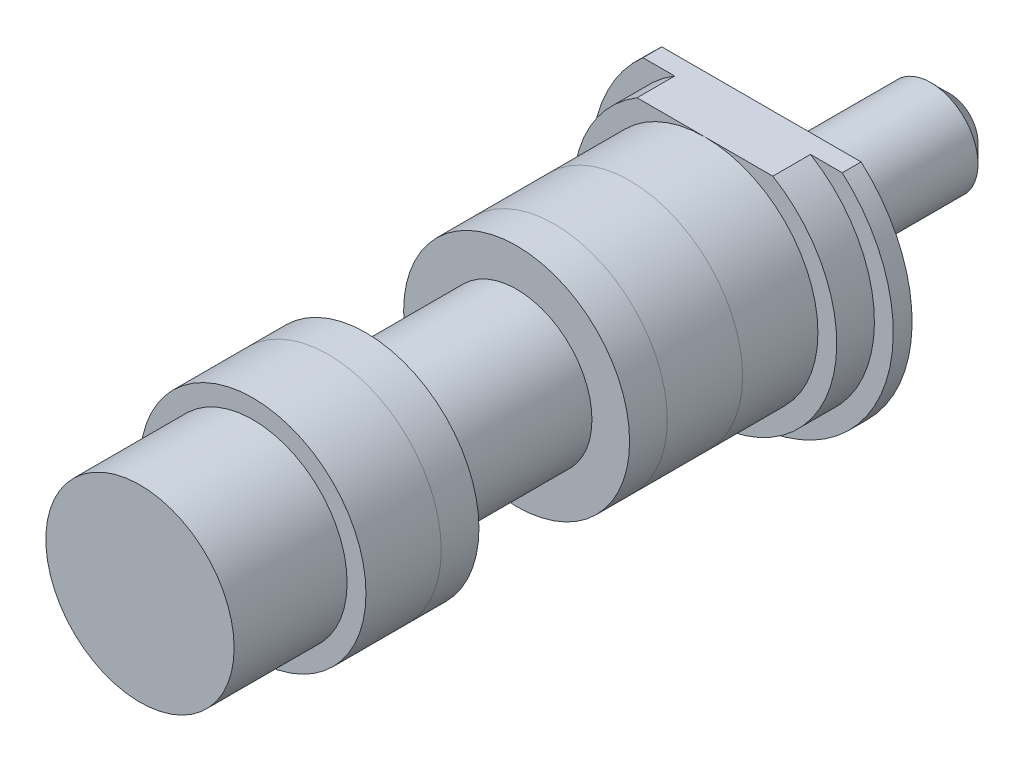
ISO-10303-21;
HEADER;
FILE_DESCRIPTION(('STEP AP214'),'2;1');
FILE_NAME('part.step','',(''),(''),'','','');
FILE_SCHEMA(('AUTOMOTIVE_DESIGN { 1 0 10303 214 1 1 1 1 }'));
ENDSEC;
DATA;
#1=APPLICATION_CONTEXT('core data for automotive mechanical design processes');
#2=APPLICATION_PROTOCOL_DEFINITION('international standard','automotive_design',2000,#1);
#3=PRODUCT_CONTEXT('',#1,'mechanical');
#4=PRODUCT('Part','Part','',(#3));
#5=PRODUCT_RELATED_PRODUCT_CATEGORY('part','',(#4));
#6=PRODUCT_DEFINITION_FORMATION('','',#4);
#7=PRODUCT_DEFINITION_CONTEXT('part definition',#1,'design');
#8=PRODUCT_DEFINITION('design','',#6,#7);
#9=PRODUCT_DEFINITION_SHAPE('','',#8);
#10=(LENGTH_UNIT() NAMED_UNIT(*) SI_UNIT(.MILLI.,.METRE.));
#11=(NAMED_UNIT(*) PLANE_ANGLE_UNIT() SI_UNIT($,.RADIAN.));
#12=(NAMED_UNIT(*) SI_UNIT($,.STERADIAN.) SOLID_ANGLE_UNIT());
#13=UNCERTAINTY_MEASURE_WITH_UNIT(LENGTH_MEASURE(1.E-05),#10,'distance_accuracy_value','');
#14=(GEOMETRIC_REPRESENTATION_CONTEXT(3) GLOBAL_UNCERTAINTY_ASSIGNED_CONTEXT((#13)) GLOBAL_UNIT_ASSIGNED_CONTEXT((#10,
#11,#12)) REPRESENTATION_CONTEXT('',''));
#15=CARTESIAN_POINT('',(0.,0.,0.));
#16=DIRECTION('',(0.,0.,1.));
#17=DIRECTION('',(1.,0.,0.));
#18=AXIS2_PLACEMENT_3D('',#15,#16,#17);
#19=CARTESIAN_POINT('',(0.,1.99999999999998,11.5));
#20=DIRECTION('',(0.,0.,-1.));
#21=DIRECTION('',(-1.,0.,0.));
#22=AXIS2_PLACEMENT_3D('',#19,#20,#21);
#23=PLANE('',#22);
#24=CARTESIAN_POINT('',(0.,0.,11.5));
#25=DIRECTION('',(0.,0.,-1.));
#26=DIRECTION('',(-1.,0.,0.));
#27=AXIS2_PLACEMENT_3D('',#24,#25,#26);
#28=CIRCLE('',#27,3.);
#29=CARTESIAN_POINT('',(-3.,0.,11.5));
#30=VERTEX_POINT('',#29);
#31=EDGE_CURVE('E11',#30,#30,#28,.T.);
#32=ORIENTED_EDGE('',*,*,#31,.T.);
#33=EDGE_LOOP('',(#32));
#34=FACE_BOUND('',#33,.T.);
#35=CARTESIAN_POINT('',(0.,0.,11.5));
#36=DIRECTION('',(0.,0.,-1.));
#37=DIRECTION('',(-1.,0.,0.));
#38=AXIS2_PLACEMENT_3D('',#35,#36,#37);
#39=CIRCLE('',#38,2.);
#40=CARTESIAN_POINT('',(-2.,0.,11.5));
#41=VERTEX_POINT('',#40);
#42=EDGE_CURVE('E57',#41,#41,#39,.T.);
#43=ORIENTED_EDGE('',*,*,#42,.F.);
#44=EDGE_LOOP('',(#43));
#45=FACE_BOUND('',#44,.T.);
#46=ADVANCED_FACE('F43',(#34,#45),#23,.T.);
#47=CARTESIAN_POINT('',(0.,0.,-0.79734990336431));
#48=DIRECTION('',(0.,0.,-1.));
#49=DIRECTION('',(-1.,0.,0.));
#50=AXIS2_PLACEMENT_3D('',#47,#48,#49);
#51=CYLINDRICAL_SURFACE('',#50,3.);
#52=CARTESIAN_POINT('',(0.,0.,13.5));
#53=DIRECTION('',(0.,0.,-1.));
#54=DIRECTION('',(-1.,0.,0.));
#55=AXIS2_PLACEMENT_3D('',#52,#53,#54);
#56=CIRCLE('',#55,3.);
#57=CARTESIAN_POINT('',(-3.,0.,13.5));
#58=VERTEX_POINT('',#57);
#59=EDGE_CURVE('E49',#58,#58,#56,.T.);
#60=ORIENTED_EDGE('',*,*,#59,.T.);
#61=EDGE_LOOP('',(#60));
#62=FACE_BOUND('',#61,.T.);
#63=ORIENTED_EDGE('',*,*,#31,.F.);
#64=EDGE_LOOP('',(#63));
#65=FACE_BOUND('',#64,.T.);
#66=ADVANCED_FACE('F67',(#62,#65),#51,.T.);
#67=CARTESIAN_POINT('',(0.,2.,13.5));
#68=DIRECTION('',(0.,0.,1.));
#69=DIRECTION('',(1.,0.,0.));
#70=AXIS2_PLACEMENT_3D('',#67,#68,#69);
#71=PLANE('',#70);
#72=CARTESIAN_POINT('',(0.,0.,13.5));
#73=DIRECTION('',(0.,0.,-1.));
#74=DIRECTION('',(-1.,0.,0.));
#75=AXIS2_PLACEMENT_3D('',#72,#73,#74);
#76=CIRCLE('',#75,2.);
#77=CARTESIAN_POINT('',(-2.,0.,13.5));
#78=VERTEX_POINT('',#77);
#79=EDGE_CURVE('E53',#78,#78,#76,.T.);
#80=ORIENTED_EDGE('',*,*,#79,.T.);
#81=EDGE_LOOP('',(#80));
#82=FACE_BOUND('',#81,.T.);
#83=ORIENTED_EDGE('',*,*,#59,.F.);
#84=EDGE_LOOP('',(#83));
#85=FACE_BOUND('',#84,.T.);
#86=ADVANCED_FACE('F71',(#82,#85),#71,.T.);
#87=CARTESIAN_POINT('',(0.,0.,-0.79734990336431));
#88=DIRECTION('',(0.,0.,-1.));
#89=DIRECTION('',(-1.,0.,0.));
#90=AXIS2_PLACEMENT_3D('',#87,#88,#89);
#91=CYLINDRICAL_SURFACE('',#90,2.);
#92=ORIENTED_EDGE('',*,*,#42,.T.);
#93=EDGE_LOOP('',(#92));
#94=FACE_BOUND('',#93,.T.);
#95=ORIENTED_EDGE('',*,*,#79,.F.);
#96=EDGE_LOOP('',(#95));
#97=FACE_BOUND('',#96,.T.);
#98=ADVANCED_FACE('F63',(#94,#97),#91,.F.);
#99=CLOSED_SHELL('',(#46,#66,#86,#98));
#100=MANIFOLD_SOLID_BREP('B2',#99);
#101=CARTESIAN_POINT('',(0.,1.99999999999997,3.49999999999999));
#102=DIRECTION('',(0.,0.,-1.));
#103=DIRECTION('',(-1.,0.,0.));
#104=AXIS2_PLACEMENT_3D('',#101,#102,#103);
#105=PLANE('',#104);
#106=CARTESIAN_POINT('',(0.,0.,3.5));
#107=DIRECTION('',(0.,0.,-1.));
#108=DIRECTION('',(-1.,0.,0.));
#109=AXIS2_PLACEMENT_3D('',#106,#107,#108);
#110=CIRCLE('',#109,3.);
#111=CARTESIAN_POINT('',(-3.,0.,3.5));
#112=VERTEX_POINT('',#111);
#113=EDGE_CURVE('E42',#112,#112,#110,.T.);
#114=ORIENTED_EDGE('',*,*,#113,.T.);
#115=EDGE_LOOP('',(#114));
#116=FACE_BOUND('',#115,.T.);
#117=CARTESIAN_POINT('',(0.,0.,3.5));
#118=DIRECTION('',(0.,0.,-1.));
#119=DIRECTION('',(-1.,0.,0.));
#120=AXIS2_PLACEMENT_3D('',#117,#118,#119);
#121=CIRCLE('',#120,2.);
#122=CARTESIAN_POINT('',(-2.,0.,3.5));
#123=VERTEX_POINT('',#122);
#124=EDGE_CURVE('E127',#123,#123,#121,.T.);
#125=ORIENTED_EDGE('',*,*,#124,.F.);
#126=EDGE_LOOP('',(#125));
#127=FACE_BOUND('',#126,.T.);
#128=ADVANCED_FACE('F113',(#116,#127),#105,.T.);
#129=CARTESIAN_POINT('',(0.,0.,-2.31170156855508));
#130=DIRECTION('',(0.,0.,-1.));
#131=DIRECTION('',(-1.,0.,0.));
#132=AXIS2_PLACEMENT_3D('',#129,#130,#131);
#133=CYLINDRICAL_SURFACE('',#132,3.);
#134=CARTESIAN_POINT('',(0.,0.,5.49999999999998));
#135=DIRECTION('',(0.,0.,-1.));
#136=DIRECTION('',(-1.,0.,0.));
#137=AXIS2_PLACEMENT_3D('',#134,#135,#136);
#138=CIRCLE('',#137,3.);
#139=CARTESIAN_POINT('',(-3.,0.,5.49999999999998));
#140=VERTEX_POINT('',#139);
#141=EDGE_CURVE('E119',#140,#140,#138,.T.);
#142=ORIENTED_EDGE('',*,*,#141,.T.);
#143=EDGE_LOOP('',(#142));
#144=FACE_BOUND('',#143,.T.);
#145=ORIENTED_EDGE('',*,*,#113,.F.);
#146=EDGE_LOOP('',(#145));
#147=FACE_BOUND('',#146,.T.);
#148=ADVANCED_FACE('F137',(#144,#147),#133,.T.);
#149=CARTESIAN_POINT('',(0.,1.99999999999996,5.49999999999999));
#150=DIRECTION('',(0.,0.,1.));
#151=DIRECTION('',(1.,0.,0.));
#152=AXIS2_PLACEMENT_3D('',#149,#150,#151);
#153=PLANE('',#152);
#154=CARTESIAN_POINT('',(0.,0.,5.49999999999998));
#155=DIRECTION('',(0.,0.,-1.));
#156=DIRECTION('',(-1.,0.,0.));
#157=AXIS2_PLACEMENT_3D('',#154,#155,#156);
#158=CIRCLE('',#157,2.);
#159=CARTESIAN_POINT('',(-2.,0.,5.49999999999998));
#160=VERTEX_POINT('',#159);
#161=EDGE_CURVE('E123',#160,#160,#158,.T.);
#162=ORIENTED_EDGE('',*,*,#161,.T.);
#163=EDGE_LOOP('',(#162));
#164=FACE_BOUND('',#163,.T.);
#165=ORIENTED_EDGE('',*,*,#141,.F.);
#166=EDGE_LOOP('',(#165));
#167=FACE_BOUND('',#166,.T.);
#168=ADVANCED_FACE('F141',(#164,#167),#153,.T.);
#169=CARTESIAN_POINT('',(0.,0.,-2.31170156855508));
#170=DIRECTION('',(0.,0.,-1.));
#171=DIRECTION('',(-1.,0.,0.));
#172=AXIS2_PLACEMENT_3D('',#169,#170,#171);
#173=CYLINDRICAL_SURFACE('',#172,2.);
#174=ORIENTED_EDGE('',*,*,#124,.T.);
#175=EDGE_LOOP('',(#174));
#176=FACE_BOUND('',#175,.T.);
#177=ORIENTED_EDGE('',*,*,#161,.F.);
#178=EDGE_LOOP('',(#177));
#179=FACE_BOUND('',#178,.T.);
#180=ADVANCED_FACE('F133',(#176,#179),#173,.F.);
#181=CLOSED_SHELL('',(#128,#148,#168,#180));
#182=MANIFOLD_SOLID_BREP('B6',#181);
#183=CARTESIAN_POINT('',(0.,0.,10.5));
#184=DIRECTION('',(0.,0.,-1.));
#185=DIRECTION('',(-1.,0.,0.));
#186=AXIS2_PLACEMENT_3D('',#183,#184,#185);
#187=CYLINDRICAL_SURFACE('',#186,2.);
#188=CARTESIAN_POINT('',(0.,0.,10.5));
#189=DIRECTION('',(0.,0.,1.));
#190=DIRECTION('',(1.,0.,0.));
#191=AXIS2_PLACEMENT_3D('',#188,#189,#190);
#192=CIRCLE('',#191,2.);
#193=CARTESIAN_POINT('',(2.,0.,10.5));
#194=VERTEX_POINT('',#193);
#195=EDGE_CURVE('E275',#194,#194,#192,.T.);
#196=ORIENTED_EDGE('',*,*,#195,.F.);
#197=EDGE_LOOP('',(#196));
#198=FACE_BOUND('',#197,.T.);
#199=CARTESIAN_POINT('',(0.,0.,6.49999999999998));
#200=DIRECTION('',(0.,0.,1.));
#201=DIRECTION('',(1.,0.,0.));
#202=AXIS2_PLACEMENT_3D('',#199,#200,#201);
#203=CIRCLE('',#202,2.);
#204=CARTESIAN_POINT('',(2.,0.,6.49999999999998));
#205=VERTEX_POINT('',#204);
#206=EDGE_CURVE('E271',#205,#205,#203,.T.);
#207=ORIENTED_EDGE('',*,*,#206,.T.);
#208=EDGE_LOOP('',(#207));
#209=FACE_BOUND('',#208,.T.);
#210=CARTESIAN_POINT('',(-2.,0.,8.99999999999998));
#211=CARTESIAN_POINT('',(-1.99999953289337,0.0276253628898729,8.99999922475393));
#212=CARTESIAN_POINT('',(-1.99942192710609,0.0552593859435506,8.99770281640871));
#213=CARTESIAN_POINT('',(-1.9971737127663,0.109735441256813,8.98859161623099));
#214=CARTESIAN_POINT('',(-1.99550248473322,0.136577015623555,8.98177426348739));
#215=CARTESIAN_POINT('',(-1.99125208777346,0.188673624060829,8.96385358217932));
#216=CARTESIAN_POINT('',(-1.98867400947362,0.213930521143294,8.95275540042823));
#217=CARTESIAN_POINT('',(-1.98288447935864,0.262224043968098,8.92660620331838));
#218=CARTESIAN_POINT('',(-1.97967300618017,0.285260594782882,8.91155505462702));
#219=CARTESIAN_POINT('',(-1.97289137863934,0.328933975766938,8.87759973678193));
#220=CARTESIAN_POINT('',(-1.96931569049511,0.34951856335365,8.85862947501359));
#221=CARTESIAN_POINT('',(-1.96224540039176,0.387249642401079,8.81751593169701));
#222=CARTESIAN_POINT('',(-1.95875080762783,0.404395745649712,8.79537229235116));
#223=CARTESIAN_POINT('',(-1.9521825856657,0.435008847599675,8.74813492442085));
#224=CARTESIAN_POINT('',(-1.94911598156868,0.448417405308423,8.72300225639652));
#225=CARTESIAN_POINT('',(-1.94383164937407,0.470798969516814,8.6707505294472));
#226=CARTESIAN_POINT('',(-1.94161378557597,0.479772685146441,8.6436317888914));
#227=CARTESIAN_POINT('',(-1.93833492239184,0.492851612268097,8.58875216726584));
#228=CARTESIAN_POINT('',(-1.93725163691808,0.497050756111091,8.56101503465006));
#229=CARTESIAN_POINT('',(-1.9362978751258,0.500753925022583,8.50521047699534));
#230=CARTESIAN_POINT('',(-1.93642720149548,0.500258713939301,8.47714310643379));
#231=CARTESIAN_POINT('',(-1.93786401832206,0.494662174879744,8.42219473075184));
#232=CARTESIAN_POINT('',(-1.93914287667292,0.489672780063489,8.39530145951163));
#233=CARTESIAN_POINT('',(-1.94268903225494,0.475408062301011,8.3427463163629));
#234=CARTESIAN_POINT('',(-1.94495639990232,0.466132434023111,8.31708453232368));
#235=CARTESIAN_POINT('',(-1.95025037968062,0.44346315931236,8.26742066124931));
#236=CARTESIAN_POINT('',(-1.95328442489807,0.430028889077622,8.24343794273681));
#237=CARTESIAN_POINT('',(-1.95976570282128,0.399452092004969,8.19802709674772));
#238=CARTESIAN_POINT('',(-1.96321300778245,0.382308916269587,8.17659941731092));
#239=CARTESIAN_POINT('',(-1.9702529351326,0.344221141560379,8.1362654614352));
#240=CARTESIAN_POINT('',(-1.9738468982599,0.323182086055272,8.11744850331288));
#241=CARTESIAN_POINT('',(-1.98068655192928,0.278203972501227,8.08359291917869));
#242=CARTESIAN_POINT('',(-1.98393223183138,0.254264825902638,8.06855440857881));
#243=CARTESIAN_POINT('',(-1.98972577364727,0.204038629560454,8.04264980459187));
#244=CARTESIAN_POINT('',(-1.99227120042574,0.1777437977362,8.03179821991518));
#245=CARTESIAN_POINT('',(-1.99635972330472,0.12362533604762,8.01469423143013));
#246=CARTESIAN_POINT('',(-1.99790301113094,0.0958019997168172,8.00844094786062));
#247=CARTESIAN_POINT('',(-1.99978499757125,0.0401799901299966,8.00084747814705));
#248=CARTESIAN_POINT('',(-2.00015351169426,0.0123989066627261,7.99938565797488));
#249=CARTESIAN_POINT('',(-1.9997293493815,-0.0430109582671733,8.00108300068514));
#250=CARTESIAN_POINT('',(-1.99893677747282,-0.0706397532148641,8.00424174759971));
#251=CARTESIAN_POINT('',(-1.99629860375786,-0.124538089592167,8.01499030279712));
#252=CARTESIAN_POINT('',(-1.99446878061937,-0.150821706322929,8.0225137544923));
#253=CARTESIAN_POINT('',(-1.98996235544711,-0.201752430817512,8.04170236134279));
#254=CARTESIAN_POINT('',(-1.98728566789964,-0.226399373010876,8.05336793477105));
#255=CARTESIAN_POINT('',(-1.98131102642103,-0.273841044809955,8.08074537629157));
#256=CARTESIAN_POINT('',(-1.9780028912231,-0.296595147278635,8.0965253707989));
#257=CARTESIAN_POINT('',(-1.97114836395806,-0.339175537881106,8.13159663626563));
#258=CARTESIAN_POINT('',(-1.96760193083902,-0.359001319657674,8.15088851320564));
#259=CARTESIAN_POINT('',(-1.96056318986924,-0.395663522690919,8.19300065361483));
#260=CARTESIAN_POINT('',(-1.95707434729093,-0.412414622540711,8.21589590100079));
#261=CARTESIAN_POINT('',(-1.95064292792412,-0.441836919670929,8.26424421148856));
#262=CARTESIAN_POINT('',(-1.94770032689009,-0.454508298052647,8.28969716098658));
#263=CARTESIAN_POINT('',(-1.94272698244888,-0.475317140203098,8.34230190747103));
#264=CARTESIAN_POINT('',(-1.94069085097301,-0.483481465551383,8.36944254278133));
#265=CARTESIAN_POINT('',(-1.93775581363394,-0.495115219984628,8.42476987929636));
#266=CARTESIAN_POINT('',(-1.93685665906646,-0.498585675826234,8.45295635034416));
#267=CARTESIAN_POINT('',(-1.93631633734653,-0.500679530111343,8.50870700795174));
#268=CARTESIAN_POINT('',(-1.93663977576088,-0.499439299260066,8.53626581170825));
#269=CARTESIAN_POINT('',(-1.93842636335947,-0.49245909277098,8.59076796288933));
#270=CARTESIAN_POINT('',(-1.93988948963952,-0.486719207562264,8.61771132267122));
#271=CARTESIAN_POINT('',(-1.94377086894241,-0.470977106480931,8.67006948635514));
#272=CARTESIAN_POINT('',(-1.94618338412103,-0.461000468226801,8.69549243508007));
#273=CARTESIAN_POINT('',(-1.95169251908276,-0.43708830453505,8.7443217942379));
#274=CARTESIAN_POINT('',(-1.95478923373591,-0.42315223001143,8.76772792439564));
#275=CARTESIAN_POINT('',(-1.96141878087837,-0.391289249545744,8.81251820966733));
#276=CARTESIAN_POINT('',(-1.96496088277252,-0.373267720970773,8.8338336911413));
#277=CARTESIAN_POINT('',(-1.97202675748762,-0.333929790396603,8.87318234826512));
#278=CARTESIAN_POINT('',(-1.97555052575687,-0.312612607087086,8.89121474337099));
#279=CARTESIAN_POINT('',(-1.98225885215888,-0.266822528900902,8.92380376952153));
#280=CARTESIAN_POINT('',(-1.98543611121956,-0.242299474105488,8.93829153789051));
#281=CARTESIAN_POINT('',(-1.99101641658372,-0.19108868650351,8.96291582098016));
#282=CARTESIAN_POINT('',(-1.99342001733261,-0.164402521145603,8.97305545354951));
#283=CARTESIAN_POINT('',(-1.99682686521847,-0.114803417747851,8.98719061010988));
#284=CARTESIAN_POINT('',(-1.9980086168423,-0.0921267236360505,8.99198374768446));
#285=CARTESIAN_POINT('',(-1.99959535077315,-0.0463020238454592,8.99838864787396));
#286=CARTESIAN_POINT('',(-2.00000039150298,-0.0231540537475735,9.00000064976841));
#287=CARTESIAN_POINT('',(-2.,0.,8.99999999999998));
#288=B_SPLINE_CURVE_WITH_KNOTS('',3,(#210,#211,#212,#213,#214,#215,#216,#217,#218,#219,#220,
#221,#222,#223,#224,#225,#226,#227,#228,#229,#230,#231,#232,#233,#234,#235,#236,#237,#238,#239,
#240,#241,#242,#243,#244,#245,#246,#247,#248,#249,#250,#251,#252,#253,#254,#255,#256,#257,#258,
#259,#260,#261,#262,#263,#264,#265,#266,#267,#268,#269,#270,#271,#272,#273,#274,#275,#276,#277,
#278,#279,#280,#281,#282,#283,#284,#285,#286,#287),.UNSPECIFIED.,.T.,.F.,(4,2,2,2,2,2,2,2,2,2,2,
2,2,2,2,2,2,2,2,2,2,2,2,2,2,2,2,2,2,2,2,2,2,2,2,2,2,2,4),(0.,0.0827912374906348,
0.165629412587971,0.248368300762033,0.33110998005644,0.415381451457141,0.499662431933562,
0.585195491819374,0.670714870564577,0.754520983664779,0.838313460375664,0.920074990023401,
1.0018423448868,1.08443509291294,1.16704230278722,1.25200500323007,1.33697029852749,
1.42222743003038,1.50746824562881,1.59052769649759,1.6735796703758,1.75540091504679,
1.83723042440763,1.92051195855118,2.00380787669341,2.08914836401493,2.17448506249838,
2.25930751538014,2.34411141084138,2.4264792679954,2.50884546985348,2.59072133519818,
2.67260856045635,2.75663192136637,2.84067523256806,2.92624061833197,3.01174454607118,
3.08114080980717,3.15053185347679),.UNSPECIFIED.);
#289=CARTESIAN_POINT('',(-2.,0.,8.99999999999998));
#290=VERTEX_POINT('',#289);
#291=EDGE_CURVE('E111',#290,#290,#288,.T.);
#292=ORIENTED_EDGE('',*,*,#291,.F.);
#293=EDGE_LOOP('',(#292));
#294=FACE_BOUND('',#293,.T.);
#295=ADVANCED_FACE('F174',(#198,#209,#294),#187,.T.);
#296=CARTESIAN_POINT('',(0.,0.,0.5));
#297=DIRECTION('',(0.,0.,-1.));
#298=DIRECTION('',(-1.,0.,0.));
#299=AXIS2_PLACEMENT_3D('',#296,#297,#298);
#300=CYLINDRICAL_SURFACE('',#299,4.);
#301=CARTESIAN_POINT('',(0.,0.,0.5));
#302=DIRECTION('',(0.,0.,1.));
#303=DIRECTION('',(1.,0.,0.));
#304=AXIS2_PLACEMENT_3D('',#301,#302,#303);
#305=CIRCLE('',#304,4.);
#306=CARTESIAN_POINT('',(-2.64575131106459,3.,0.5));
#307=VERTEX_POINT('',#306);
#308=CARTESIAN_POINT('',(2.64575131106459,3.,0.5));
#309=VERTEX_POINT('',#308);
#310=EDGE_CURVE('E307',#307,#309,#305,.T.);
#311=ORIENTED_EDGE('',*,*,#310,.F.);
#312=DIRECTION('',(0.,0.,-1.));
#313=VECTOR('',#312,1.);
#314=CARTESIAN_POINT('',(-2.64575131106459,3.,0.5));
#315=LINE('',#314,#313);
#316=CARTESIAN_POINT('',(-2.64575131106459,3.,0.));
#317=VERTEX_POINT('',#316);
#318=EDGE_CURVE('E251',#307,#317,#315,.T.);
#319=ORIENTED_EDGE('',*,*,#318,.T.);
#320=CARTESIAN_POINT('',(0.,0.,0.));
#321=DIRECTION('',(0.,0.,1.));
#322=DIRECTION('',(1.,0.,0.));
#323=AXIS2_PLACEMENT_3D('',#320,#321,#322);
#324=CIRCLE('',#323,4.);
#325=CARTESIAN_POINT('',(2.64575131106459,3.,0.));
#326=VERTEX_POINT('',#325);
#327=EDGE_CURVE('E304',#317,#326,#324,.T.);
#328=ORIENTED_EDGE('',*,*,#327,.T.);
#329=DIRECTION('',(0.,0.,-1.));
#330=VECTOR('',#329,1.);
#331=CARTESIAN_POINT('',(2.64575131106459,3.,0.5));
#332=LINE('',#331,#330);
#333=EDGE_CURVE('E244',#326,#309,#332,.F.);
#334=ORIENTED_EDGE('',*,*,#333,.T.);
#335=EDGE_LOOP('',(#311,#319,#328,#334));
#336=FACE_BOUND('',#335,.T.);
#337=ADVANCED_FACE('F345',(#336),#300,.T.);
#338=CARTESIAN_POINT('',(0.,0.,0.5));
#339=DIRECTION('',(0.,0.,1.));
#340=DIRECTION('',(1.,0.,0.));
#341=AXIS2_PLACEMENT_3D('',#338,#339,#340);
#342=PLANE('',#341);
#343=DIRECTION('',(1.,0.,0.));
#344=VECTOR('',#343,1.);
#345=CARTESIAN_POINT('',(0.,3.,0.5));
#346=LINE('',#345,#344);
#347=CARTESIAN_POINT('',(-1.80277563773199,2.99999999999997,0.5));
#348=VERTEX_POINT('',#347);
#349=EDGE_CURVE('E245',#307,#348,#346,.T.);
#350=ORIENTED_EDGE('',*,*,#349,.F.);
#351=ORIENTED_EDGE('',*,*,#310,.T.);
#352=CARTESIAN_POINT('',(1.802775637732,2.99999999999998,0.5));
#353=VERTEX_POINT('',#352);
#354=EDGE_CURVE('E242',#353,#309,#346,.T.);
#355=ORIENTED_EDGE('',*,*,#354,.F.);
#356=CARTESIAN_POINT('',(0.,0.,0.5));
#357=DIRECTION('',(0.,0.,1.));
#358=DIRECTION('',(1.,0.,0.));
#359=AXIS2_PLACEMENT_3D('',#356,#357,#358);
#360=CIRCLE('',#359,3.5);
#361=EDGE_CURVE('E301',#348,#353,#360,.T.);
#362=ORIENTED_EDGE('',*,*,#361,.F.);
#363=EDGE_LOOP('',(#350,#351,#355,#362));
#364=FACE_BOUND('',#363,.T.);
#365=ADVANCED_FACE('F350',(#364),#342,.T.);
#366=CARTESIAN_POINT('',(0.,0.,0.));
#367=DIRECTION('',(0.,0.,1.));
#368=DIRECTION('',(1.,0.,0.));
#369=AXIS2_PLACEMENT_3D('',#366,#367,#368);
#370=PLANE('',#369);
#371=CARTESIAN_POINT('',(0.,0.,0.));
#372=DIRECTION('',(0.,0.,1.));
#373=DIRECTION('',(1.,0.,0.));
#374=AXIS2_PLACEMENT_3D('',#371,#372,#373);
#375=CIRCLE('',#374,2.25);
#376=CARTESIAN_POINT('',(2.25,0.,0.));
#377=VERTEX_POINT('',#376);
#378=EDGE_CURVE('E314',#377,#377,#375,.T.);
#379=ORIENTED_EDGE('',*,*,#378,.T.);
#380=EDGE_LOOP('',(#379));
#381=FACE_BOUND('',#380,.T.);
#382=ORIENTED_EDGE('',*,*,#327,.F.);
#383=DIRECTION('',(1.,0.,0.));
#384=VECTOR('',#383,1.);
#385=CARTESIAN_POINT('',(0.,2.99999999999999,0.));
#386=LINE('',#385,#384);
#387=EDGE_CURVE('E248',#317,#326,#386,.T.);
#388=ORIENTED_EDGE('',*,*,#387,.T.);
#389=EDGE_LOOP('',(#382,#388));
#390=FACE_BOUND('',#389,.T.);
#391=ADVANCED_FACE('F391',(#381,#390),#370,.F.);
#392=CARTESIAN_POINT('',(0.,0.,1.5));
#393=DIRECTION('',(0.,0.,-1.));
#394=DIRECTION('',(-1.,0.,0.));
#395=AXIS2_PLACEMENT_3D('',#392,#393,#394);
#396=CYLINDRICAL_SURFACE('',#395,3.5);
#397=CARTESIAN_POINT('',(0.,0.,1.5));
#398=DIRECTION('',(0.,0.,1.));
#399=DIRECTION('',(1.,0.,0.));
#400=AXIS2_PLACEMENT_3D('',#397,#398,#399);
#401=CIRCLE('',#400,3.5);
#402=CARTESIAN_POINT('',(-1.80277563773199,2.99999999999999,1.5));
#403=VERTEX_POINT('',#402);
#404=CARTESIAN_POINT('',(1.802775637732,2.99999999999996,1.5));
#405=VERTEX_POINT('',#404);
#406=EDGE_CURVE('E298',#403,#405,#401,.T.);
#407=ORIENTED_EDGE('',*,*,#406,.F.);
#408=DIRECTION('',(0.,0.,-1.));
#409=VECTOR('',#408,1.);
#410=CARTESIAN_POINT('',(-1.80277563773199,2.99999999999999,1.5));
#411=LINE('',#410,#409);
#412=EDGE_CURVE('E254',#403,#348,#411,.T.);
#413=ORIENTED_EDGE('',*,*,#412,.T.);
#414=ORIENTED_EDGE('',*,*,#361,.T.);
#415=DIRECTION('',(0.,0.,-1.));
#416=VECTOR('',#415,1.);
#417=CARTESIAN_POINT('',(1.802775637732,2.99999999999996,1.5));
#418=LINE('',#417,#416);
#419=EDGE_CURVE('E239',#353,#405,#418,.F.);
#420=ORIENTED_EDGE('',*,*,#419,.T.);
#421=EDGE_LOOP('',(#407,#413,#414,#420));
#422=FACE_BOUND('',#421,.T.);
#423=ADVANCED_FACE('F387',(#422),#396,.T.);
#424=CARTESIAN_POINT('',(0.,0.,1.5));
#425=DIRECTION('',(0.,0.,1.));
#426=DIRECTION('',(1.,0.,0.));
#427=AXIS2_PLACEMENT_3D('',#424,#425,#426);
#428=PLANE('',#427);
#429=DIRECTION('',(1.,0.,0.));
#430=VECTOR('',#429,1.);
#431=CARTESIAN_POINT('',(-3.03815540564658,2.99999999999998,1.5));
#432=LINE('',#431,#430);
#433=CARTESIAN_POINT('',(0.,2.99999999999996,1.5));
#434=VERTEX_POINT('',#433);
#435=EDGE_CURVE('E201',#403,#434,#432,.T.);
#436=ORIENTED_EDGE('',*,*,#435,.F.);
#437=ORIENTED_EDGE('',*,*,#406,.T.);
#438=EDGE_CURVE('E234',#434,#405,#432,.T.);
#439=ORIENTED_EDGE('',*,*,#438,.F.);
#440=CARTESIAN_POINT('',(0.,0.,1.5));
#441=DIRECTION('',(0.,0.,1.));
#442=DIRECTION('',(1.,0.,0.));
#443=AXIS2_PLACEMENT_3D('',#440,#441,#442);
#444=CIRCLE('',#443,3.);
#445=EDGE_CURVE('E295',#434,#434,#444,.T.);
#446=ORIENTED_EDGE('',*,*,#445,.F.);
#447=EDGE_LOOP('',(#436,#437,#439,#446));
#448=FACE_BOUND('',#447,.T.);
#449=ADVANCED_FACE('F383',(#448),#428,.T.);
#450=CARTESIAN_POINT('',(0.,0.,3.5));
#451=DIRECTION('',(0.,0.,-1.));
#452=DIRECTION('',(-1.,0.,0.));
#453=AXIS2_PLACEMENT_3D('',#450,#451,#452);
#454=CYLINDRICAL_SURFACE('',#453,3.);
#455=CARTESIAN_POINT('',(0.,0.,3.5));
#456=DIRECTION('',(0.,0.,1.));
#457=DIRECTION('',(1.,0.,0.));
#458=AXIS2_PLACEMENT_3D('',#455,#456,#457);
#459=CIRCLE('',#458,3.);
#460=CARTESIAN_POINT('',(3.,0.,3.5));
#461=VERTEX_POINT('',#460);
#462=EDGE_CURVE('E292',#461,#461,#459,.T.);
#463=ORIENTED_EDGE('',*,*,#462,.F.);
#464=EDGE_LOOP('',(#463));
#465=FACE_BOUND('',#464,.T.);
#466=ORIENTED_EDGE('',*,*,#445,.T.);
#467=EDGE_LOOP('',(#466));
#468=FACE_BOUND('',#467,.T.);
#469=ADVANCED_FACE('F379',(#465,#468),#454,.T.);
#470=CARTESIAN_POINT('',(0.,0.,3.5));
#471=DIRECTION('',(0.,0.,1.));
#472=DIRECTION('',(1.,0.,0.));
#473=AXIS2_PLACEMENT_3D('',#470,#471,#472);
#474=PLANE('',#473);
#475=CARTESIAN_POINT('',(0.,0.,3.5));
#476=DIRECTION('',(0.,0.,1.));
#477=DIRECTION('',(1.,0.,0.));
#478=AXIS2_PLACEMENT_3D('',#475,#476,#477);
#479=CIRCLE('',#478,2.);
#480=CARTESIAN_POINT('',(2.,0.,3.5));
#481=VERTEX_POINT('',#480);
#482=EDGE_CURVE('E283',#481,#481,#479,.T.);
#483=ORIENTED_EDGE('',*,*,#482,.F.);
#484=EDGE_LOOP('',(#483));
#485=FACE_BOUND('',#484,.T.);
#486=ORIENTED_EDGE('',*,*,#462,.T.);
#487=EDGE_LOOP('',(#486));
#488=FACE_BOUND('',#487,.T.);
#489=ADVANCED_FACE('F375',(#485,#488),#474,.T.);
#490=CARTESIAN_POINT('',(0.,0.,5.49999999999998));
#491=DIRECTION('',(0.,0.,-1.));
#492=DIRECTION('',(-1.,0.,0.));
#493=AXIS2_PLACEMENT_3D('',#490,#491,#492);
#494=CYLINDRICAL_SURFACE('',#493,2.);
#495=CARTESIAN_POINT('',(0.,0.,5.49999999999998));
#496=DIRECTION('',(0.,0.,1.));
#497=DIRECTION('',(1.,0.,0.));
#498=AXIS2_PLACEMENT_3D('',#495,#496,#497);
#499=CIRCLE('',#498,2.);
#500=CARTESIAN_POINT('',(2.,0.,5.49999999999998));
#501=VERTEX_POINT('',#500);
#502=EDGE_CURVE('E287',#501,#501,#499,.T.);
#503=ORIENTED_EDGE('',*,*,#502,.F.);
#504=EDGE_LOOP('',(#503));
#505=FACE_BOUND('',#504,.T.);
#506=ORIENTED_EDGE('',*,*,#482,.T.);
#507=EDGE_LOOP('',(#506));
#508=FACE_BOUND('',#507,.T.);
#509=ADVANCED_FACE('F371',(#505,#508),#494,.T.);
#510=CARTESIAN_POINT('',(0.,0.,6.49999999999998));
#511=DIRECTION('',(0.,0.,-1.));
#512=DIRECTION('',(-1.,0.,0.));
#513=AXIS2_PLACEMENT_3D('',#510,#511,#512);
#514=CYLINDRICAL_SURFACE('',#513,3.);
#515=CARTESIAN_POINT('',(0.,0.,6.49999999999998));
#516=DIRECTION('',(0.,0.,1.));
#517=DIRECTION('',(1.,0.,0.));
#518=AXIS2_PLACEMENT_3D('',#515,#516,#517);
#519=CIRCLE('',#518,3.);
#520=CARTESIAN_POINT('',(3.,0.,6.49999999999998));
#521=VERTEX_POINT('',#520);
#522=EDGE_CURVE('E284',#521,#521,#519,.T.);
#523=ORIENTED_EDGE('',*,*,#522,.F.);
#524=EDGE_LOOP('',(#523));
#525=FACE_BOUND('',#524,.T.);
#526=CARTESIAN_POINT('',(0.,0.,5.49999999999998));
#527=DIRECTION('',(0.,0.,1.));
#528=DIRECTION('',(1.,0.,0.));
#529=AXIS2_PLACEMENT_3D('',#526,#527,#528);
#530=CIRCLE('',#529,3.);
#531=CARTESIAN_POINT('',(3.,0.,5.49999999999998));
#532=VERTEX_POINT('',#531);
#533=EDGE_CURVE('E280',#532,#532,#530,.T.);
#534=ORIENTED_EDGE('',*,*,#533,.T.);
#535=EDGE_LOOP('',(#534));
#536=FACE_BOUND('',#535,.T.);
#537=ADVANCED_FACE('F364',(#525,#536),#514,.T.);
#538=CARTESIAN_POINT('',(0.,0.,6.49999999999998));
#539=DIRECTION('',(0.,0.,1.));
#540=DIRECTION('',(1.,0.,0.));
#541=AXIS2_PLACEMENT_3D('',#538,#539,#540);
#542=PLANE('',#541);
#543=ORIENTED_EDGE('',*,*,#206,.F.);
#544=EDGE_LOOP('',(#543));
#545=FACE_BOUND('',#544,.T.);
#546=ORIENTED_EDGE('',*,*,#522,.T.);
#547=EDGE_LOOP('',(#546));
#548=FACE_BOUND('',#547,.T.);
#549=ADVANCED_FACE('F360',(#545,#548),#542,.T.);
#550=CARTESIAN_POINT('',(0.,0.,5.49999999999998));
#551=DIRECTION('',(0.,0.,1.));
#552=DIRECTION('',(1.,0.,0.));
#553=AXIS2_PLACEMENT_3D('',#550,#551,#552);
#554=PLANE('',#553);
#555=ORIENTED_EDGE('',*,*,#502,.T.);
#556=EDGE_LOOP('',(#555));
#557=FACE_BOUND('',#556,.T.);
#558=ORIENTED_EDGE('',*,*,#533,.F.);
#559=EDGE_LOOP('',(#558));
#560=FACE_BOUND('',#559,.T.);
#561=ADVANCED_FACE('F363',(#557,#560),#554,.F.);
#562=CARTESIAN_POINT('',(0.,0.,11.5));
#563=DIRECTION('',(0.,0.,-1.));
#564=DIRECTION('',(-1.,0.,0.));
#565=AXIS2_PLACEMENT_3D('',#562,#563,#564);
#566=CYLINDRICAL_SURFACE('',#565,3.);
#567=CARTESIAN_POINT('',(0.,0.,11.5));
#568=DIRECTION('',(0.,0.,1.));
#569=DIRECTION('',(1.,0.,0.));
#570=AXIS2_PLACEMENT_3D('',#567,#568,#569);
#571=CIRCLE('',#570,3.);
#572=CARTESIAN_POINT('',(3.,0.,11.5));
#573=VERTEX_POINT('',#572);
#574=EDGE_CURVE('E272',#573,#573,#571,.T.);
#575=ORIENTED_EDGE('',*,*,#574,.F.);
#576=EDGE_LOOP('',(#575));
#577=FACE_BOUND('',#576,.T.);
#578=CARTESIAN_POINT('',(0.,0.,10.5));
#579=DIRECTION('',(0.,0.,1.));
#580=DIRECTION('',(1.,0.,0.));
#581=AXIS2_PLACEMENT_3D('',#578,#579,#580);
#582=CIRCLE('',#581,3.);
#583=CARTESIAN_POINT('',(3.,0.,10.5));
#584=VERTEX_POINT('',#583);
#585=EDGE_CURVE('E266',#584,#584,#582,.T.);
#586=ORIENTED_EDGE('',*,*,#585,.T.);
#587=EDGE_LOOP('',(#586));
#588=FACE_BOUND('',#587,.T.);
#589=ADVANCED_FACE('F358',(#577,#588),#566,.T.);
#590=CARTESIAN_POINT('',(0.,0.,11.5));
#591=DIRECTION('',(0.,0.,1.));
#592=DIRECTION('',(1.,0.,0.));
#593=AXIS2_PLACEMENT_3D('',#590,#591,#592);
#594=PLANE('',#593);
#595=CARTESIAN_POINT('',(0.,0.,11.5));
#596=DIRECTION('',(0.,0.,1.));
#597=DIRECTION('',(1.,0.,0.));
#598=AXIS2_PLACEMENT_3D('',#595,#596,#597);
#599=CIRCLE('',#598,2.);
#600=CARTESIAN_POINT('',(2.,0.,11.5));
#601=VERTEX_POINT('',#600);
#602=EDGE_CURVE('E267',#601,#601,#599,.T.);
#603=ORIENTED_EDGE('',*,*,#602,.F.);
#604=EDGE_LOOP('',(#603));
#605=FACE_BOUND('',#604,.T.);
#606=ORIENTED_EDGE('',*,*,#574,.T.);
#607=EDGE_LOOP('',(#606));
#608=FACE_BOUND('',#607,.T.);
#609=ADVANCED_FACE('F513',(#605,#608),#594,.T.);
#610=CARTESIAN_POINT('',(0.,0.,10.5));
#611=DIRECTION('',(0.,0.,1.));
#612=DIRECTION('',(1.,0.,0.));
#613=AXIS2_PLACEMENT_3D('',#610,#611,#612);
#614=PLANE('',#613);
#615=ORIENTED_EDGE('',*,*,#195,.T.);
#616=EDGE_LOOP('',(#615));
#617=FACE_BOUND('',#616,.T.);
#618=ORIENTED_EDGE('',*,*,#585,.F.);
#619=EDGE_LOOP('',(#618));
#620=FACE_BOUND('',#619,.T.);
#621=ADVANCED_FACE('F503',(#617,#620),#614,.F.);
#622=CARTESIAN_POINT('',(0.,0.,13.5));
#623=DIRECTION('',(0.,0.,-1.));
#624=DIRECTION('',(-1.,0.,0.));
#625=AXIS2_PLACEMENT_3D('',#622,#623,#624);
#626=CYLINDRICAL_SURFACE('',#625,2.);
#627=CARTESIAN_POINT('',(0.,0.,13.5));
#628=DIRECTION('',(0.,0.,1.));
#629=DIRECTION('',(1.,0.,0.));
#630=AXIS2_PLACEMENT_3D('',#627,#628,#629);
#631=CIRCLE('',#630,2.);
#632=CARTESIAN_POINT('',(2.,0.,13.5));
#633=VERTEX_POINT('',#632);
#634=EDGE_CURVE('E261',#633,#633,#631,.T.);
#635=ORIENTED_EDGE('',*,*,#634,.F.);
#636=EDGE_LOOP('',(#635));
#637=FACE_BOUND('',#636,.T.);
#638=ORIENTED_EDGE('',*,*,#602,.T.);
#639=EDGE_LOOP('',(#638));
#640=FACE_BOUND('',#639,.T.);
#641=ADVANCED_FACE('F494',(#637,#640),#626,.T.);
#642=CARTESIAN_POINT('',(0.,0.,16.5));
#643=DIRECTION('',(0.,0.,-1.));
#644=DIRECTION('',(-1.,0.,0.));
#645=AXIS2_PLACEMENT_3D('',#642,#643,#644);
#646=CYLINDRICAL_SURFACE('',#645,2.5);
#647=CARTESIAN_POINT('',(0.,0.,16.5));
#648=DIRECTION('',(0.,0.,1.));
#649=DIRECTION('',(1.,0.,0.));
#650=AXIS2_PLACEMENT_3D('',#647,#648,#649);
#651=CIRCLE('',#650,2.5);
#652=CARTESIAN_POINT('',(2.50000000000001,0.,16.5));
#653=VERTEX_POINT('',#652);
#654=EDGE_CURVE('E258',#653,#653,#651,.T.);
#655=ORIENTED_EDGE('',*,*,#654,.F.);
#656=EDGE_LOOP('',(#655));
#657=FACE_BOUND('',#656,.T.);
#658=CARTESIAN_POINT('',(0.,0.,13.5));
#659=DIRECTION('',(0.,0.,1.));
#660=DIRECTION('',(1.,0.,0.));
#661=AXIS2_PLACEMENT_3D('',#658,#659,#660);
#662=CIRCLE('',#661,2.5);
#663=CARTESIAN_POINT('',(2.5,0.,13.5));
#664=VERTEX_POINT('',#663);
#665=EDGE_CURVE('E257',#664,#664,#662,.T.);
#666=ORIENTED_EDGE('',*,*,#665,.T.);
#667=EDGE_LOOP('',(#666));
#668=FACE_BOUND('',#667,.T.);
#669=ADVANCED_FACE('F483',(#657,#668),#646,.T.);
#670=CARTESIAN_POINT('',(0.,0.,16.5));
#671=DIRECTION('',(0.,0.,1.));
#672=DIRECTION('',(1.,0.,0.));
#673=AXIS2_PLACEMENT_3D('',#670,#671,#672);
#674=PLANE('',#673);
#675=ORIENTED_EDGE('',*,*,#654,.T.);
#676=EDGE_LOOP('',(#675));
#677=FACE_BOUND('',#676,.T.);
#678=ADVANCED_FACE('F473',(#677),#674,.T.);
#679=CARTESIAN_POINT('',(0.,0.,13.5));
#680=DIRECTION('',(0.,0.,1.));
#681=DIRECTION('',(1.,0.,0.));
#682=AXIS2_PLACEMENT_3D('',#679,#680,#681);
#683=PLANE('',#682);
#684=ORIENTED_EDGE('',*,*,#634,.T.);
#685=EDGE_LOOP('',(#684));
#686=FACE_BOUND('',#685,.T.);
#687=ORIENTED_EDGE('',*,*,#665,.F.);
#688=EDGE_LOOP('',(#687));
#689=FACE_BOUND('',#688,.T.);
#690=ADVANCED_FACE('F340',(#686,#689),#683,.F.);
#691=CARTESIAN_POINT('',(0.,0.,-5.));
#692=DIRECTION('',(0.,0.,1.));
#693=DIRECTION('',(1.,0.,0.));
#694=AXIS2_PLACEMENT_3D('',#691,#692,#693);
#695=CYLINDRICAL_SURFACE('',#694,1.25);
#696=CARTESIAN_POINT('',(0.,0.,-4.49999999999999));
#697=DIRECTION('',(0.,0.,-1.));
#698=DIRECTION('',(-1.,0.,0.));
#699=AXIS2_PLACEMENT_3D('',#696,#697,#698);
#700=CIRCLE('',#699,1.25);
#701=CARTESIAN_POINT('',(-1.25,0.,-4.49999999999999));
#702=VERTEX_POINT('',#701);
#703=EDGE_CURVE('E187',#702,#702,#700,.F.);
#704=ORIENTED_EDGE('',*,*,#703,.T.);
#705=EDGE_LOOP('',(#704));
#706=FACE_BOUND('',#705,.T.);
#707=CARTESIAN_POINT('',(0.,0.,-1.00000000000001));
#708=DIRECTION('',(0.,0.,1.));
#709=DIRECTION('',(1.,0.,0.));
#710=AXIS2_PLACEMENT_3D('',#707,#708,#709);
#711=CIRCLE('',#710,1.25);
#712=CARTESIAN_POINT('',(1.25,0.,-1.00000000000001));
#713=VERTEX_POINT('',#712);
#714=EDGE_CURVE('E270',#713,#713,#711,.F.);
#715=ORIENTED_EDGE('',*,*,#714,.T.);
#716=EDGE_LOOP('',(#715));
#717=FACE_BOUND('',#716,.T.);
#718=ADVANCED_FACE('F322',(#706,#717),#695,.T.);
#719=CARTESIAN_POINT('',(0.,0.,-5.));
#720=DIRECTION('',(0.,0.,-1.));
#721=DIRECTION('',(-1.,0.,0.));
#722=AXIS2_PLACEMENT_3D('',#719,#720,#721);
#723=PLANE('',#722);
#724=CARTESIAN_POINT('',(0.,0.,-5.));
#725=DIRECTION('',(0.,0.,-1.));
#726=DIRECTION('',(-1.,0.,0.));
#727=AXIS2_PLACEMENT_3D('',#724,#725,#726);
#728=CIRCLE('',#727,0.5);
#729=CARTESIAN_POINT('',(-0.499999999999997,0.,-5.));
#730=VERTEX_POINT('',#729);
#731=EDGE_CURVE('E425',#730,#730,#728,.T.);
#732=ORIENTED_EDGE('',*,*,#731,.F.);
#733=EDGE_LOOP('',(#732));
#734=FACE_BOUND('',#733,.T.);
#735=CARTESIAN_POINT('',(0.,0.,-5.));
#736=DIRECTION('',(0.,0.,-1.));
#737=DIRECTION('',(-1.,0.,0.));
#738=AXIS2_PLACEMENT_3D('',#735,#736,#737);
#739=CIRCLE('',#738,0.749999999999994);
#740=CARTESIAN_POINT('',(-0.74999999999999,0.,-5.));
#741=VERTEX_POINT('',#740);
#742=EDGE_CURVE('E317',#741,#741,#739,.T.);
#743=ORIENTED_EDGE('',*,*,#742,.T.);
#744=EDGE_LOOP('',(#743));
#745=FACE_BOUND('',#744,.T.);
#746=ADVANCED_FACE('F331',(#734,#745),#723,.T.);
#747=CARTESIAN_POINT('',(0.,0.,-1.00000000000001));
#748=DIRECTION('',(0.,0.,1.));
#749=DIRECTION('',(1.,0.,0.));
#750=AXIS2_PLACEMENT_3D('',#747,#748,#749);
#751=CONICAL_SURFACE('',#750,1.25,0.785398163397443);
#752=ORIENTED_EDGE('',*,*,#378,.F.);
#753=EDGE_LOOP('',(#752));
#754=FACE_BOUND('',#753,.T.);
#755=ORIENTED_EDGE('',*,*,#714,.F.);
#756=EDGE_LOOP('',(#755));
#757=FACE_BOUND('',#756,.T.);
#758=ADVANCED_FACE('F328',(#754,#757),#751,.T.);
#759=CARTESIAN_POINT('',(0.,0.,-5.));
#760=DIRECTION('',(0.,0.,1.));
#761=DIRECTION('',(1.,0.,0.));
#762=AXIS2_PLACEMENT_3D('',#759,#760,#761);
#763=CONICAL_SURFACE('',#762,0.749999999999994,0.785398163397447);
#764=ORIENTED_EDGE('',*,*,#703,.F.);
#765=EDGE_LOOP('',(#764));
#766=FACE_BOUND('',#765,.T.);
#767=ORIENTED_EDGE('',*,*,#742,.F.);
#768=EDGE_LOOP('',(#767));
#769=FACE_BOUND('',#768,.T.);
#770=ADVANCED_FACE('F176',(#766,#769),#763,.T.);
#771=CARTESIAN_POINT('',(-3.03815540564657,2.99999999999997,-4.5));
#772=DIRECTION('',(0.,-1.,0.));
#773=DIRECTION('',(0.,0.,-1.));
#774=AXIS2_PLACEMENT_3D('',#771,#772,#773);
#775=PLANE('',#774);
#776=ORIENTED_EDGE('',*,*,#435,.T.);
#777=ORIENTED_EDGE('',*,*,#438,.T.);
#778=ORIENTED_EDGE('',*,*,#419,.F.);
#779=ORIENTED_EDGE('',*,*,#354,.T.);
#780=ORIENTED_EDGE('',*,*,#333,.F.);
#781=ORIENTED_EDGE('',*,*,#387,.F.);
#782=ORIENTED_EDGE('',*,*,#318,.F.);
#783=ORIENTED_EDGE('',*,*,#349,.T.);
#784=ORIENTED_EDGE('',*,*,#412,.F.);
#785=EDGE_LOOP('',(#776,#777,#778,#779,#780,#781,#782,#783,#784));
#786=FACE_BOUND('',#785,.T.);
#787=ADVANCED_FACE('F327',(#786),#775,.F.);
#788=CARTESIAN_POINT('',(0.,0.,8.49999999999998));
#789=DIRECTION('',(-1.,0.,0.));
#790=DIRECTION('',(0.,0.,1.));
#791=AXIS2_PLACEMENT_3D('',#788,#789,#790);
#792=CYLINDRICAL_SURFACE('',#791,0.500000000000001);
#793=CARTESIAN_POINT('',(0.,0.,8.49999999999998));
#794=DIRECTION('',(-0.707106781186548,0.,-0.707106781186547));
#795=DIRECTION('',(-0.707106781186548,0.,0.707106781186547));
#796=AXIS2_PLACEMENT_3D('',#793,#794,#795);
#797=ELLIPSE('',#796,0.707106781186548,0.5);
#798=CARTESIAN_POINT('',(0.,-0.5,8.4999999999999));
#799=VERTEX_POINT('',#798);
#800=CARTESIAN_POINT('',(0.,0.499999999999973,8.49999999999999));
#801=VERTEX_POINT('',#800);
#802=EDGE_CURVE('E193',#799,#801,#797,.T.);
#803=ORIENTED_EDGE('',*,*,#802,.F.);
#804=CARTESIAN_POINT('',(0.,0.,8.49999999999998));
#805=DIRECTION('',(-0.707106781186548,0.,0.707106781186547));
#806=DIRECTION('',(-0.707106781186548,0.,-0.707106781186547));
#807=AXIS2_PLACEMENT_3D('',#804,#805,#806);
#808=ELLIPSE('',#807,0.707106781186548,0.5);
#809=EDGE_CURVE('E226',#801,#799,#808,.T.);
#810=ORIENTED_EDGE('',*,*,#809,.F.);
#811=EDGE_LOOP('',(#803,#810));
#812=FACE_BOUND('',#811,.T.);
#813=ORIENTED_EDGE('',*,*,#291,.T.);
#814=EDGE_LOOP('',(#813));
#815=FACE_BOUND('',#814,.T.);
#816=ADVANCED_FACE('F232',(#812,#815),#792,.F.);
#817=CARTESIAN_POINT('',(0.,0.,9.99999999999998));
#818=DIRECTION('',(0.,0.,-1.));
#819=DIRECTION('',(-1.,0.,0.));
#820=AXIS2_PLACEMENT_3D('',#817,#818,#819);
#821=CYLINDRICAL_SURFACE('',#820,0.5);
#822=ORIENTED_EDGE('',*,*,#802,.T.);
#823=ORIENTED_EDGE('',*,*,#809,.T.);
#824=EDGE_LOOP('',(#822,#823));
#825=FACE_BOUND('',#824,.T.);
#826=CARTESIAN_POINT('',(0.,0.,9.99999999999998));
#827=DIRECTION('',(0.,0.,-1.));
#828=DIRECTION('',(-1.,0.,0.));
#829=AXIS2_PLACEMENT_3D('',#826,#827,#828);
#830=CIRCLE('',#829,0.5);
#831=CARTESIAN_POINT('',(-0.499999999999999,0.,9.99999999999998));
#832=VERTEX_POINT('',#831);
#833=EDGE_CURVE('E230',#832,#832,#830,.T.);
#834=ORIENTED_EDGE('',*,*,#833,.F.);
#835=EDGE_LOOP('',(#834));
#836=FACE_BOUND('',#835,.T.);
#837=ORIENTED_EDGE('',*,*,#731,.T.);
#838=EDGE_LOOP('',(#837));
#839=FACE_BOUND('',#838,.T.);
#840=ADVANCED_FACE('F227',(#825,#836,#839),#821,.F.);
#841=CARTESIAN_POINT('',(0.,0.,9.99999999999998));
#842=DIRECTION('',(0.,0.,-1.));
#843=DIRECTION('',(-1.,0.,0.));
#844=AXIS2_PLACEMENT_3D('',#841,#842,#843);
#845=PLANE('',#844);
#846=ORIENTED_EDGE('',*,*,#833,.T.);
#847=EDGE_LOOP('',(#846));
#848=FACE_BOUND('',#847,.T.);
#849=ADVANCED_FACE('F418',(#848),#845,.T.);
#850=CLOSED_SHELL('',(#295,#337,#365,#391,#423,#449,#469,#489,#509,#537,#549,#561,#589,#609,
#621,#641,#669,#678,#690,#718,#746,#758,#770,#787,#816,#840,#849));
#851=MANIFOLD_SOLID_BREP('B37',#850);
#852=ADVANCED_BREP_SHAPE_REPRESENTATION('',(#18,#100,#182,#851),#14);
#853=SHAPE_DEFINITION_REPRESENTATION(#9,#852);
ENDSEC;
END-ISO-10303-21;
